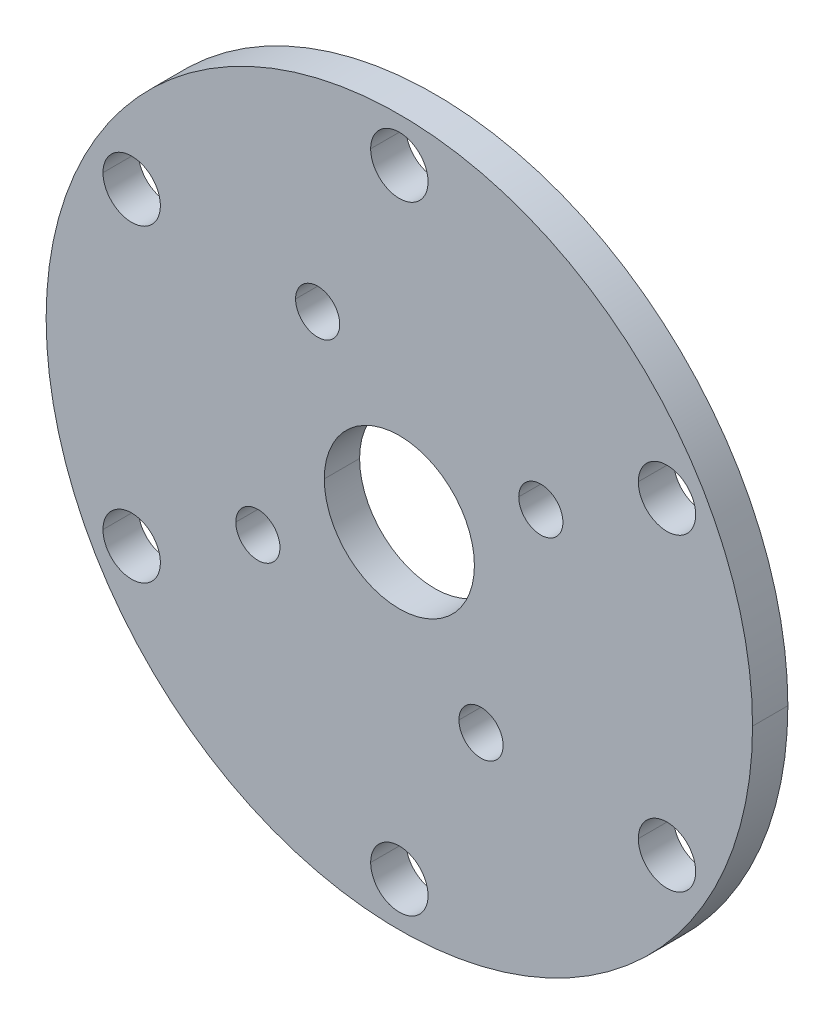
ISO-10303-21;
HEADER;
FILE_DESCRIPTION(('STEP AP214'),'2;1');
FILE_NAME('part.step','',(''),(''),'','','');
FILE_SCHEMA(('AUTOMOTIVE_DESIGN { 1 0 10303 214 1 1 1 1 }'));
ENDSEC;
DATA;
#1=APPLICATION_CONTEXT('core data for automotive mechanical design processes');
#2=APPLICATION_PROTOCOL_DEFINITION('international standard','automotive_design',2000,#1);
#3=PRODUCT_CONTEXT('',#1,'mechanical');
#4=PRODUCT('Part','Part','',(#3));
#5=PRODUCT_RELATED_PRODUCT_CATEGORY('part','',(#4));
#6=PRODUCT_DEFINITION_FORMATION('','',#4);
#7=PRODUCT_DEFINITION_CONTEXT('part definition',#1,'design');
#8=PRODUCT_DEFINITION('design','',#6,#7);
#9=PRODUCT_DEFINITION_SHAPE('','',#8);
#10=(LENGTH_UNIT() NAMED_UNIT(*) SI_UNIT(.MILLI.,.METRE.));
#11=(NAMED_UNIT(*) PLANE_ANGLE_UNIT() SI_UNIT($,.RADIAN.));
#12=(NAMED_UNIT(*) SI_UNIT($,.STERADIAN.) SOLID_ANGLE_UNIT());
#13=UNCERTAINTY_MEASURE_WITH_UNIT(LENGTH_MEASURE(1.E-05),#10,'distance_accuracy_value','');
#14=(GEOMETRIC_REPRESENTATION_CONTEXT(3) GLOBAL_UNCERTAINTY_ASSIGNED_CONTEXT((#13)) GLOBAL_UNIT_ASSIGNED_CONTEXT((#10,
#11,#12)) REPRESENTATION_CONTEXT('',''));
#15=CARTESIAN_POINT('',(0.,0.,0.));
#16=DIRECTION('',(0.,0.,1.));
#17=DIRECTION('',(1.,0.,0.));
#18=AXIS2_PLACEMENT_3D('',#15,#16,#17);
#19=CARTESIAN_POINT('',(0.,0.,4.));
#20=DIRECTION('',(0.,0.,-1.));
#21=DIRECTION('',(-1.,0.,0.));
#22=AXIS2_PLACEMENT_3D('',#19,#20,#21);
#23=CYLINDRICAL_SURFACE('',#22,40.);
#24=CARTESIAN_POINT('',(0.,0.,4.));
#25=DIRECTION('',(0.,0.,1.));
#26=DIRECTION('',(1.,0.,0.));
#27=AXIS2_PLACEMENT_3D('',#24,#25,#26);
#28=CIRCLE('',#27,40.);
#29=CARTESIAN_POINT('',(40.,0.,4.));
#30=VERTEX_POINT('',#29);
#31=CARTESIAN_POINT('',(-40.,0.,4.));
#32=VERTEX_POINT('',#31);
#33=EDGE_CURVE('E42',#30,#32,#28,.T.);
#34=ORIENTED_EDGE('',*,*,#33,.F.);
#35=DIRECTION('',(0.,0.,-1.));
#36=VECTOR('',#35,1.);
#37=CARTESIAN_POINT('',(40.,0.,4.));
#38=LINE('',#37,#36);
#39=CARTESIAN_POINT('',(40.,0.,0.));
#40=VERTEX_POINT('',#39);
#41=EDGE_CURVE('E11',#30,#40,#38,.T.);
#42=ORIENTED_EDGE('',*,*,#41,.T.);
#43=CARTESIAN_POINT('',(0.,0.,0.));
#44=DIRECTION('',(0.,0.,1.));
#45=DIRECTION('',(1.,0.,0.));
#46=AXIS2_PLACEMENT_3D('',#43,#44,#45);
#47=CIRCLE('',#46,40.);
#48=CARTESIAN_POINT('',(-40.,0.,0.));
#49=VERTEX_POINT('',#48);
#50=EDGE_CURVE('E28',#40,#49,#47,.T.);
#51=ORIENTED_EDGE('',*,*,#50,.T.);
#52=DIRECTION('',(0.,0.,-1.));
#53=VECTOR('',#52,1.);
#54=CARTESIAN_POINT('',(-40.,0.,4.));
#55=LINE('',#54,#53);
#56=EDGE_CURVE('E283',#32,#49,#55,.T.);
#57=ORIENTED_EDGE('',*,*,#56,.F.);
#58=EDGE_LOOP('',(#34,#42,#51,#57));
#59=FACE_BOUND('',#58,.T.);
#60=ADVANCED_FACE('F17',(#59),#23,.T.);
#61=CARTESIAN_POINT('',(-9.25,16.0214699700122,4.));
#62=DIRECTION('',(0.,0.,-1.));
#63=DIRECTION('',(-1.,0.,0.));
#64=AXIS2_PLACEMENT_3D('',#61,#62,#63);
#65=CYLINDRICAL_SURFACE('',#64,2.5);
#66=CARTESIAN_POINT('',(-9.25,16.0214699700122,4.));
#67=DIRECTION('',(0.,0.,1.));
#68=DIRECTION('',(1.,0.,0.));
#69=AXIS2_PLACEMENT_3D('',#66,#67,#68);
#70=CIRCLE('',#69,2.5);
#71=CARTESIAN_POINT('',(-11.75,16.0214699700122,4.));
#72=VERTEX_POINT('',#71);
#73=CARTESIAN_POINT('',(-6.74999999999991,16.0214699700122,4.));
#74=VERTEX_POINT('',#73);
#75=EDGE_CURVE('E330',#72,#74,#70,.T.);
#76=ORIENTED_EDGE('',*,*,#75,.T.);
#77=DIRECTION('',(0.,0.,-1.));
#78=VECTOR('',#77,1.);
#79=CARTESIAN_POINT('',(-6.74999999999991,16.0214699700122,4.));
#80=LINE('',#79,#78);
#81=CARTESIAN_POINT('',(-6.74999999999991,16.0214699700122,0.));
#82=VERTEX_POINT('',#81);
#83=EDGE_CURVE('E258',#74,#82,#80,.T.);
#84=ORIENTED_EDGE('',*,*,#83,.T.);
#85=CARTESIAN_POINT('',(-9.25,16.0214699700122,0.));
#86=DIRECTION('',(0.,0.,1.));
#87=DIRECTION('',(1.,0.,0.));
#88=AXIS2_PLACEMENT_3D('',#85,#86,#87);
#89=CIRCLE('',#88,2.5);
#90=CARTESIAN_POINT('',(-11.75,16.0214699700122,0.));
#91=VERTEX_POINT('',#90);
#92=EDGE_CURVE('E223',#91,#82,#89,.T.);
#93=ORIENTED_EDGE('',*,*,#92,.F.);
#94=DIRECTION('',(0.,0.,-1.));
#95=VECTOR('',#94,1.);
#96=CARTESIAN_POINT('',(-11.75,16.0214699700122,4.));
#97=LINE('',#96,#95);
#98=EDGE_CURVE('E331',#72,#91,#97,.T.);
#99=ORIENTED_EDGE('',*,*,#98,.F.);
#100=EDGE_LOOP('',(#76,#84,#93,#99));
#101=FACE_BOUND('',#100,.T.);
#102=ADVANCED_FACE('F574',(#101),#65,.F.);
#103=CARTESIAN_POINT('',(0.,0.,4.));
#104=DIRECTION('',(0.,0.,-1.));
#105=DIRECTION('',(-1.,0.,0.));
#106=AXIS2_PLACEMENT_3D('',#103,#104,#105);
#107=CYLINDRICAL_SURFACE('',#106,8.5);
#108=CARTESIAN_POINT('',(0.,0.,4.));
#109=DIRECTION('',(0.,0.,1.));
#110=DIRECTION('',(1.,0.,0.));
#111=AXIS2_PLACEMENT_3D('',#108,#109,#110);
#112=CIRCLE('',#111,8.5);
#113=CARTESIAN_POINT('',(-8.5,0.,4.));
#114=VERTEX_POINT('',#113);
#115=CARTESIAN_POINT('',(8.5,0.,4.));
#116=VERTEX_POINT('',#115);
#117=EDGE_CURVE('E250',#114,#116,#112,.T.);
#118=ORIENTED_EDGE('',*,*,#117,.T.);
#119=DIRECTION('',(0.,0.,-1.));
#120=VECTOR('',#119,1.);
#121=CARTESIAN_POINT('',(8.5,0.,4.));
#122=LINE('',#121,#120);
#123=CARTESIAN_POINT('',(8.5,0.,0.));
#124=VERTEX_POINT('',#123);
#125=EDGE_CURVE('E240',#116,#124,#122,.T.);
#126=ORIENTED_EDGE('',*,*,#125,.T.);
#127=CARTESIAN_POINT('',(0.,0.,0.));
#128=DIRECTION('',(0.,0.,1.));
#129=DIRECTION('',(1.,0.,0.));
#130=AXIS2_PLACEMENT_3D('',#127,#128,#129);
#131=CIRCLE('',#130,8.5);
#132=CARTESIAN_POINT('',(-8.5,0.,0.));
#133=VERTEX_POINT('',#132);
#134=EDGE_CURVE('E398',#133,#124,#131,.T.);
#135=ORIENTED_EDGE('',*,*,#134,.F.);
#136=DIRECTION('',(0.,0.,-1.));
#137=VECTOR('',#136,1.);
#138=CARTESIAN_POINT('',(-8.5,0.,4.));
#139=LINE('',#138,#137);
#140=EDGE_CURVE('E255',#114,#133,#139,.T.);
#141=ORIENTED_EDGE('',*,*,#140,.F.);
#142=EDGE_LOOP('',(#118,#126,#135,#141));
#143=FACE_BOUND('',#142,.T.);
#144=ADVANCED_FACE('F254',(#143),#107,.F.);
#145=CARTESIAN_POINT('',(-16.0214699700117,-9.25,4.));
#146=DIRECTION('',(0.,0.,-1.));
#147=DIRECTION('',(-1.,0.,0.));
#148=AXIS2_PLACEMENT_3D('',#145,#146,#147);
#149=CYLINDRICAL_SURFACE('',#148,2.5);
#150=CARTESIAN_POINT('',(-16.0214699700117,-9.25,4.));
#151=DIRECTION('',(0.,0.,1.));
#152=DIRECTION('',(1.,0.,0.));
#153=AXIS2_PLACEMENT_3D('',#150,#151,#152);
#154=CIRCLE('',#153,2.5);
#155=CARTESIAN_POINT('',(-18.5214699700117,-9.25,4.));
#156=VERTEX_POINT('',#155);
#157=CARTESIAN_POINT('',(-13.5214699700116,-9.25,4.));
#158=VERTEX_POINT('',#157);
#159=EDGE_CURVE('E251',#156,#158,#154,.T.);
#160=ORIENTED_EDGE('',*,*,#159,.T.);
#161=DIRECTION('',(0.,0.,-1.));
#162=VECTOR('',#161,1.);
#163=CARTESIAN_POINT('',(-13.5214699700116,-9.25,4.));
#164=LINE('',#163,#162);
#165=CARTESIAN_POINT('',(-13.5214699700116,-9.25,0.));
#166=VERTEX_POINT('',#165);
#167=EDGE_CURVE('E304',#158,#166,#164,.T.);
#168=ORIENTED_EDGE('',*,*,#167,.T.);
#169=CARTESIAN_POINT('',(-16.0214699700117,-9.25,0.));
#170=DIRECTION('',(0.,0.,1.));
#171=DIRECTION('',(1.,0.,0.));
#172=AXIS2_PLACEMENT_3D('',#169,#170,#171);
#173=CIRCLE('',#172,2.5);
#174=CARTESIAN_POINT('',(-18.5214699700117,-9.25,0.));
#175=VERTEX_POINT('',#174);
#176=EDGE_CURVE('E395',#175,#166,#173,.T.);
#177=ORIENTED_EDGE('',*,*,#176,.F.);
#178=DIRECTION('',(0.,0.,-1.));
#179=VECTOR('',#178,1.);
#180=CARTESIAN_POINT('',(-18.5214699700117,-9.25,4.));
#181=LINE('',#180,#179);
#182=EDGE_CURVE('E263',#156,#175,#181,.T.);
#183=ORIENTED_EDGE('',*,*,#182,.F.);
#184=EDGE_LOOP('',(#160,#168,#177,#183));
#185=FACE_BOUND('',#184,.T.);
#186=ADVANCED_FACE('F584',(#185),#149,.F.);
#187=CARTESIAN_POINT('',(16.0214699700123,9.25000000000043,4.));
#188=DIRECTION('',(0.,0.,-1.));
#189=DIRECTION('',(-1.,0.,0.));
#190=AXIS2_PLACEMENT_3D('',#187,#188,#189);
#191=CYLINDRICAL_SURFACE('',#190,2.5);
#192=CARTESIAN_POINT('',(16.0214699700123,9.25000000000043,4.));
#193=DIRECTION('',(0.,0.,1.));
#194=DIRECTION('',(1.,0.,0.));
#195=AXIS2_PLACEMENT_3D('',#192,#193,#194);
#196=CIRCLE('',#195,2.5);
#197=CARTESIAN_POINT('',(13.5214699700123,9.25000000000043,4.));
#198=VERTEX_POINT('',#197);
#199=CARTESIAN_POINT('',(18.5214699700123,9.25000000000043,4.));
#200=VERTEX_POINT('',#199);
#201=EDGE_CURVE('E308',#198,#200,#196,.T.);
#202=ORIENTED_EDGE('',*,*,#201,.T.);
#203=DIRECTION('',(0.,0.,-1.));
#204=VECTOR('',#203,1.);
#205=CARTESIAN_POINT('',(18.5214699700123,9.25000000000043,4.));
#206=LINE('',#205,#204);
#207=CARTESIAN_POINT('',(18.5214699700123,9.25000000000043,0.));
#208=VERTEX_POINT('',#207);
#209=EDGE_CURVE('E334',#200,#208,#206,.T.);
#210=ORIENTED_EDGE('',*,*,#209,.T.);
#211=CARTESIAN_POINT('',(16.0214699700123,9.25000000000043,0.));
#212=DIRECTION('',(0.,0.,1.));
#213=DIRECTION('',(1.,0.,0.));
#214=AXIS2_PLACEMENT_3D('',#211,#212,#213);
#215=CIRCLE('',#214,2.5);
#216=CARTESIAN_POINT('',(13.5214699700123,9.25000000000043,0.));
#217=VERTEX_POINT('',#216);
#218=EDGE_CURVE('E345',#217,#208,#215,.T.);
#219=ORIENTED_EDGE('',*,*,#218,.F.);
#220=DIRECTION('',(0.,0.,-1.));
#221=VECTOR('',#220,1.);
#222=CARTESIAN_POINT('',(13.5214699700123,9.25000000000043,4.));
#223=LINE('',#222,#221);
#224=EDGE_CURVE('E288',#198,#217,#223,.T.);
#225=ORIENTED_EDGE('',*,*,#224,.F.);
#226=EDGE_LOOP('',(#202,#210,#219,#225));
#227=FACE_BOUND('',#226,.T.);
#228=ADVANCED_FACE('F823',(#227),#191,.F.);
#229=CARTESIAN_POINT('',(-30.3108891324539,17.4999999999992,4.));
#230=DIRECTION('',(0.,0.,-1.));
#231=DIRECTION('',(-1.,0.,0.));
#232=AXIS2_PLACEMENT_3D('',#229,#230,#231);
#233=CYLINDRICAL_SURFACE('',#232,3.25000000000089);
#234=CARTESIAN_POINT('',(-30.3108891324539,17.4999999999992,4.));
#235=DIRECTION('',(0.,0.,1.));
#236=DIRECTION('',(1.,0.,0.));
#237=AXIS2_PLACEMENT_3D('',#234,#235,#236);
#238=CIRCLE('',#237,3.25000000000089);
#239=CARTESIAN_POINT('',(-33.5608891324547,17.4999999999992,4.));
#240=VERTEX_POINT('',#239);
#241=CARTESIAN_POINT('',(-27.060889132453,17.4999999999992,4.));
#242=VERTEX_POINT('',#241);
#243=EDGE_CURVE('E338',#240,#242,#238,.T.);
#244=ORIENTED_EDGE('',*,*,#243,.T.);
#245=DIRECTION('',(0.,0.,-1.));
#246=VECTOR('',#245,1.);
#247=CARTESIAN_POINT('',(-27.060889132453,17.4999999999992,4.));
#248=LINE('',#247,#246);
#249=CARTESIAN_POINT('',(-27.060889132453,17.4999999999992,0.));
#250=VERTEX_POINT('',#249);
#251=EDGE_CURVE('E462',#242,#250,#248,.T.);
#252=ORIENTED_EDGE('',*,*,#251,.T.);
#253=CARTESIAN_POINT('',(-30.3108891324539,17.4999999999992,0.));
#254=DIRECTION('',(0.,0.,1.));
#255=DIRECTION('',(1.,0.,0.));
#256=AXIS2_PLACEMENT_3D('',#253,#254,#255);
#257=CIRCLE('',#256,3.25000000000089);
#258=CARTESIAN_POINT('',(-33.5608891324547,17.4999999999992,0.));
#259=VERTEX_POINT('',#258);
#260=EDGE_CURVE('E357',#259,#250,#257,.T.);
#261=ORIENTED_EDGE('',*,*,#260,.F.);
#262=DIRECTION('',(0.,0.,-1.));
#263=VECTOR('',#262,1.);
#264=CARTESIAN_POINT('',(-33.5608891324547,17.4999999999992,4.));
#265=LINE('',#264,#263);
#266=EDGE_CURVE('E339',#240,#259,#265,.T.);
#267=ORIENTED_EDGE('',*,*,#266,.F.);
#268=EDGE_LOOP('',(#244,#252,#261,#267));
#269=FACE_BOUND('',#268,.T.);
#270=ADVANCED_FACE('F602',(#269),#233,.F.);
#271=CARTESIAN_POINT('',(9.25000000000057,-16.0214699700118,4.));
#272=DIRECTION('',(0.,0.,-1.));
#273=DIRECTION('',(-1.,0.,0.));
#274=AXIS2_PLACEMENT_3D('',#271,#272,#273);
#275=CYLINDRICAL_SURFACE('',#274,2.5);
#276=CARTESIAN_POINT('',(9.25000000000057,-16.0214699700118,4.));
#277=DIRECTION('',(0.,0.,1.));
#278=DIRECTION('',(1.,0.,0.));
#279=AXIS2_PLACEMENT_3D('',#276,#277,#278);
#280=CIRCLE('',#279,2.5);
#281=CARTESIAN_POINT('',(6.75000000000057,-16.0214699700118,4.));
#282=VERTEX_POINT('',#281);
#283=CARTESIAN_POINT('',(11.7500000000006,-16.0214699700118,4.));
#284=VERTEX_POINT('',#283);
#285=EDGE_CURVE('E466',#282,#284,#280,.T.);
#286=ORIENTED_EDGE('',*,*,#285,.T.);
#287=DIRECTION('',(0.,0.,-1.));
#288=VECTOR('',#287,1.);
#289=CARTESIAN_POINT('',(11.7500000000006,-16.0214699700118,4.));
#290=LINE('',#289,#288);
#291=CARTESIAN_POINT('',(11.7500000000006,-16.0214699700118,0.));
#292=VERTEX_POINT('',#291);
#293=EDGE_CURVE('E470',#284,#292,#290,.T.);
#294=ORIENTED_EDGE('',*,*,#293,.T.);
#295=CARTESIAN_POINT('',(9.25000000000057,-16.0214699700118,0.));
#296=DIRECTION('',(0.,0.,1.));
#297=DIRECTION('',(1.,0.,0.));
#298=AXIS2_PLACEMENT_3D('',#295,#296,#297);
#299=CIRCLE('',#298,2.5);
#300=CARTESIAN_POINT('',(6.75000000000057,-16.0214699700118,0.));
#301=VERTEX_POINT('',#300);
#302=EDGE_CURVE('E358',#301,#292,#299,.T.);
#303=ORIENTED_EDGE('',*,*,#302,.F.);
#304=DIRECTION('',(0.,0.,-1.));
#305=VECTOR('',#304,1.);
#306=CARTESIAN_POINT('',(6.75000000000057,-16.0214699700118,4.));
#307=LINE('',#306,#305);
#308=EDGE_CURVE('E454',#282,#301,#307,.T.);
#309=ORIENTED_EDGE('',*,*,#308,.F.);
#310=EDGE_LOOP('',(#286,#294,#303,#309));
#311=FACE_BOUND('',#310,.T.);
#312=ADVANCED_FACE('F519',(#311),#275,.F.);
#313=CARTESIAN_POINT('',(0.,35.,4.));
#314=DIRECTION('',(0.,0.,-1.));
#315=DIRECTION('',(-1.,0.,0.));
#316=AXIS2_PLACEMENT_3D('',#313,#314,#315);
#317=CYLINDRICAL_SURFACE('',#316,3.25);
#318=CARTESIAN_POINT('',(0.,35.,4.));
#319=DIRECTION('',(0.,0.,1.));
#320=DIRECTION('',(1.,0.,0.));
#321=AXIS2_PLACEMENT_3D('',#318,#319,#320);
#322=CIRCLE('',#321,3.25);
#323=CARTESIAN_POINT('',(-3.25,35.,4.));
#324=VERTEX_POINT('',#323);
#325=CARTESIAN_POINT('',(3.25,35.,4.));
#326=VERTEX_POINT('',#325);
#327=EDGE_CURVE('E474',#324,#326,#322,.T.);
#328=ORIENTED_EDGE('',*,*,#327,.T.);
#329=DIRECTION('',(0.,0.,-1.));
#330=VECTOR('',#329,1.);
#331=CARTESIAN_POINT('',(3.25,35.,4.));
#332=LINE('',#331,#330);
#333=CARTESIAN_POINT('',(3.25,35.,0.));
#334=VERTEX_POINT('',#333);
#335=EDGE_CURVE('E298',#326,#334,#332,.T.);
#336=ORIENTED_EDGE('',*,*,#335,.T.);
#337=CARTESIAN_POINT('',(0.,35.,0.));
#338=DIRECTION('',(0.,0.,1.));
#339=DIRECTION('',(1.,0.,0.));
#340=AXIS2_PLACEMENT_3D('',#337,#338,#339);
#341=CIRCLE('',#340,3.25);
#342=CARTESIAN_POINT('',(-3.25,35.,0.));
#343=VERTEX_POINT('',#342);
#344=EDGE_CURVE('E382',#343,#334,#341,.T.);
#345=ORIENTED_EDGE('',*,*,#344,.F.);
#346=DIRECTION('',(0.,0.,-1.));
#347=VECTOR('',#346,1.);
#348=CARTESIAN_POINT('',(-3.25,35.,4.));
#349=LINE('',#348,#347);
#350=EDGE_CURVE('E389',#324,#343,#349,.T.);
#351=ORIENTED_EDGE('',*,*,#350,.F.);
#352=EDGE_LOOP('',(#328,#336,#345,#351));
#353=FACE_BOUND('',#352,.T.);
#354=ADVANCED_FACE('F815',(#353),#317,.F.);
#355=CARTESIAN_POINT('',(-30.3108891324524,-17.5,4.));
#356=DIRECTION('',(0.,0.,-1.));
#357=DIRECTION('',(-1.,0.,0.));
#358=AXIS2_PLACEMENT_3D('',#355,#356,#357);
#359=CYLINDRICAL_SURFACE('',#358,3.25000000000247);
#360=CARTESIAN_POINT('',(-30.3108891324524,-17.5,4.));
#361=DIRECTION('',(0.,0.,1.));
#362=DIRECTION('',(1.,0.,0.));
#363=AXIS2_PLACEMENT_3D('',#360,#361,#362);
#364=CIRCLE('',#363,3.25000000000247);
#365=CARTESIAN_POINT('',(-33.5608891324548,-17.5,4.));
#366=VERTEX_POINT('',#365);
#367=CARTESIAN_POINT('',(-27.0608891324499,-17.5,4.));
#368=VERTEX_POINT('',#367);
#369=EDGE_CURVE('E294',#366,#368,#364,.T.);
#370=ORIENTED_EDGE('',*,*,#369,.T.);
#371=DIRECTION('',(0.,0.,-1.));
#372=VECTOR('',#371,1.);
#373=CARTESIAN_POINT('',(-27.0608891324499,-17.5,4.));
#374=LINE('',#373,#372);
#375=CARTESIAN_POINT('',(-27.0608891324499,-17.5,0.));
#376=VERTEX_POINT('',#375);
#377=EDGE_CURVE('E299',#368,#376,#374,.T.);
#378=ORIENTED_EDGE('',*,*,#377,.T.);
#379=CARTESIAN_POINT('',(-30.3108891324524,-17.5,0.));
#380=DIRECTION('',(0.,0.,1.));
#381=DIRECTION('',(1.,0.,0.));
#382=AXIS2_PLACEMENT_3D('',#379,#380,#381);
#383=CIRCLE('',#382,3.25000000000247);
#384=CARTESIAN_POINT('',(-33.5608891324548,-17.5,0.));
#385=VERTEX_POINT('',#384);
#386=EDGE_CURVE('E362',#385,#376,#383,.T.);
#387=ORIENTED_EDGE('',*,*,#386,.F.);
#388=DIRECTION('',(0.,0.,-1.));
#389=VECTOR('',#388,1.);
#390=CARTESIAN_POINT('',(-33.5608891324548,-17.5,4.));
#391=LINE('',#390,#389);
#392=EDGE_CURVE('E388',#366,#385,#391,.T.);
#393=ORIENTED_EDGE('',*,*,#392,.F.);
#394=EDGE_LOOP('',(#370,#378,#387,#393));
#395=FACE_BOUND('',#394,.T.);
#396=ADVANCED_FACE('F568',(#395),#359,.F.);
#397=CARTESIAN_POINT('',(2.95747950929986E-12,-34.9999999999983,4.));
#398=DIRECTION('',(0.,0.,-1.));
#399=DIRECTION('',(-1.,0.,0.));
#400=AXIS2_PLACEMENT_3D('',#397,#398,#399);
#401=CYLINDRICAL_SURFACE('',#400,3.25000000000357);
#402=CARTESIAN_POINT('',(2.95747950929986E-12,-34.9999999999983,4.));
#403=DIRECTION('',(0.,0.,1.));
#404=DIRECTION('',(1.,0.,0.));
#405=AXIS2_PLACEMENT_3D('',#402,#403,#404);
#406=CIRCLE('',#405,3.25000000000357);
#407=CARTESIAN_POINT('',(-3.25000000000061,-34.9999999999983,4.));
#408=VERTEX_POINT('',#407);
#409=CARTESIAN_POINT('',(3.25000000000653,-34.9999999999983,4.));
#410=VERTEX_POINT('',#409);
#411=EDGE_CURVE('E402',#408,#410,#406,.T.);
#412=ORIENTED_EDGE('',*,*,#411,.T.);
#413=DIRECTION('',(0.,0.,-1.));
#414=VECTOR('',#413,1.);
#415=CARTESIAN_POINT('',(3.25000000000653,-34.9999999999983,4.));
#416=LINE('',#415,#414);
#417=CARTESIAN_POINT('',(3.25000000000653,-34.9999999999983,0.));
#418=VERTEX_POINT('',#417);
#419=EDGE_CURVE('E436',#410,#418,#416,.T.);
#420=ORIENTED_EDGE('',*,*,#419,.T.);
#421=CARTESIAN_POINT('',(2.95747950929986E-12,-34.9999999999983,0.));
#422=DIRECTION('',(0.,0.,1.));
#423=DIRECTION('',(1.,0.,0.));
#424=AXIS2_PLACEMENT_3D('',#421,#422,#423);
#425=CIRCLE('',#424,3.25000000000357);
#426=CARTESIAN_POINT('',(-3.25000000000061,-34.9999999999983,0.));
#427=VERTEX_POINT('',#426);
#428=EDGE_CURVE('E371',#427,#418,#425,.T.);
#429=ORIENTED_EDGE('',*,*,#428,.F.);
#430=DIRECTION('',(0.,0.,-1.));
#431=VECTOR('',#430,1.);
#432=CARTESIAN_POINT('',(-3.25000000000061,-34.9999999999983,4.));
#433=LINE('',#432,#431);
#434=EDGE_CURVE('E309',#408,#427,#433,.T.);
#435=ORIENTED_EDGE('',*,*,#434,.F.);
#436=EDGE_LOOP('',(#412,#420,#429,#435));
#437=FACE_BOUND('',#436,.T.);
#438=ADVANCED_FACE('F560',(#437),#401,.F.);
#439=CARTESIAN_POINT('',(30.3108891324568,-17.4999999999974,4.));
#440=DIRECTION('',(0.,0.,-1.));
#441=DIRECTION('',(-1.,0.,0.));
#442=AXIS2_PLACEMENT_3D('',#439,#440,#441);
#443=CYLINDRICAL_SURFACE('',#442,3.25000000000301);
#444=CARTESIAN_POINT('',(30.3108891324568,-17.4999999999974,4.));
#445=DIRECTION('',(0.,0.,1.));
#446=DIRECTION('',(1.,0.,0.));
#447=AXIS2_PLACEMENT_3D('',#444,#445,#446);
#448=CIRCLE('',#447,3.25000000000301);
#449=CARTESIAN_POINT('',(27.0608891324538,-17.4999999999974,4.));
#450=VERTEX_POINT('',#449);
#451=CARTESIAN_POINT('',(33.5608891324598,-17.4999999999974,4.));
#452=VERTEX_POINT('',#451);
#453=EDGE_CURVE('E440',#450,#452,#448,.T.);
#454=ORIENTED_EDGE('',*,*,#453,.T.);
#455=DIRECTION('',(0.,0.,-1.));
#456=VECTOR('',#455,1.);
#457=CARTESIAN_POINT('',(33.5608891324598,-17.4999999999974,4.));
#458=LINE('',#457,#456);
#459=CARTESIAN_POINT('',(33.5608891324598,-17.4999999999974,0.));
#460=VERTEX_POINT('',#459);
#461=EDGE_CURVE('E434',#452,#460,#458,.T.);
#462=ORIENTED_EDGE('',*,*,#461,.T.);
#463=CARTESIAN_POINT('',(30.3108891324568,-17.4999999999974,0.));
#464=DIRECTION('',(0.,0.,1.));
#465=DIRECTION('',(1.,0.,0.));
#466=AXIS2_PLACEMENT_3D('',#463,#464,#465);
#467=CIRCLE('',#466,3.25000000000301);
#468=CARTESIAN_POINT('',(27.0608891324538,-17.4999999999974,0.));
#469=VERTEX_POINT('',#468);
#470=EDGE_CURVE('E372',#469,#460,#467,.T.);
#471=ORIENTED_EDGE('',*,*,#470,.F.);
#472=DIRECTION('',(0.,0.,-1.));
#473=VECTOR('',#472,1.);
#474=CARTESIAN_POINT('',(27.0608891324538,-17.4999999999974,4.));
#475=LINE('',#474,#473);
#476=EDGE_CURVE('E323',#450,#469,#475,.T.);
#477=ORIENTED_EDGE('',*,*,#476,.F.);
#478=EDGE_LOOP('',(#454,#462,#471,#477));
#479=FACE_BOUND('',#478,.T.);
#480=ADVANCED_FACE('F558',(#479),#443,.F.);
#481=CARTESIAN_POINT('',(30.3108891324554,17.5000000000017,4.));
#482=DIRECTION('',(0.,0.,-1.));
#483=DIRECTION('',(-1.,0.,0.));
#484=AXIS2_PLACEMENT_3D('',#481,#482,#483);
#485=CYLINDRICAL_SURFACE('',#484,3.25000000000125);
#486=CARTESIAN_POINT('',(30.3108891324554,17.5000000000017,4.));
#487=DIRECTION('',(0.,0.,1.));
#488=DIRECTION('',(1.,0.,0.));
#489=AXIS2_PLACEMENT_3D('',#486,#487,#488);
#490=CIRCLE('',#489,3.25000000000124);
#491=CARTESIAN_POINT('',(27.0608891324541,17.5000000000017,4.));
#492=VERTEX_POINT('',#491);
#493=CARTESIAN_POINT('',(33.5608891324566,17.5000000000017,4.));
#494=VERTEX_POINT('',#493);
#495=EDGE_CURVE('E303',#492,#494,#490,.T.);
#496=ORIENTED_EDGE('',*,*,#495,.T.);
#497=DIRECTION('',(0.,0.,-1.));
#498=VECTOR('',#497,1.);
#499=CARTESIAN_POINT('',(33.5608891324566,17.5000000000017,4.));
#500=LINE('',#499,#498);
#501=CARTESIAN_POINT('',(33.5608891324566,17.5000000000017,0.));
#502=VERTEX_POINT('',#501);
#503=EDGE_CURVE('E293',#494,#502,#500,.T.);
#504=ORIENTED_EDGE('',*,*,#503,.T.);
#505=CARTESIAN_POINT('',(30.3108891324554,17.5000000000017,0.));
#506=DIRECTION('',(0.,0.,1.));
#507=DIRECTION('',(1.,0.,0.));
#508=AXIS2_PLACEMENT_3D('',#505,#506,#507);
#509=CIRCLE('',#508,3.25000000000124);
#510=CARTESIAN_POINT('',(27.0608891324541,17.5000000000017,0.));
#511=VERTEX_POINT('',#510);
#512=EDGE_CURVE('E322',#511,#502,#509,.T.);
#513=ORIENTED_EDGE('',*,*,#512,.F.);
#514=DIRECTION('',(0.,0.,-1.));
#515=VECTOR('',#514,1.);
#516=CARTESIAN_POINT('',(27.0608891324541,17.5000000000017,4.));
#517=LINE('',#516,#515);
#518=EDGE_CURVE('E21',#492,#511,#517,.T.);
#519=ORIENTED_EDGE('',*,*,#518,.F.);
#520=EDGE_LOOP('',(#496,#504,#513,#519));
#521=FACE_BOUND('',#520,.T.);
#522=ADVANCED_FACE('F539',(#521),#485,.F.);
#523=CARTESIAN_POINT('',(30.3108891324554,17.5000000000017,4.));
#524=DIRECTION('',(0.,0.,-1.));
#525=DIRECTION('',(-1.,0.,0.));
#526=AXIS2_PLACEMENT_3D('',#523,#524,#525);
#527=CYLINDRICAL_SURFACE('',#526,3.25000000000125);
#528=ORIENTED_EDGE('',*,*,#503,.F.);
#529=CARTESIAN_POINT('',(30.3108891324554,17.5000000000017,4.));
#530=DIRECTION('',(0.,0.,1.));
#531=DIRECTION('',(1.,0.,0.));
#532=AXIS2_PLACEMENT_3D('',#529,#530,#531);
#533=CIRCLE('',#532,3.25000000000124);
#534=EDGE_CURVE('E289',#494,#492,#533,.T.);
#535=ORIENTED_EDGE('',*,*,#534,.T.);
#536=ORIENTED_EDGE('',*,*,#518,.T.);
#537=CARTESIAN_POINT('',(30.3108891324554,17.5000000000017,0.));
#538=DIRECTION('',(0.,0.,1.));
#539=DIRECTION('',(1.,0.,0.));
#540=AXIS2_PLACEMENT_3D('',#537,#538,#539);
#541=CIRCLE('',#540,3.25000000000124);
#542=EDGE_CURVE('E318',#502,#511,#541,.T.);
#543=ORIENTED_EDGE('',*,*,#542,.F.);
#544=EDGE_LOOP('',(#528,#535,#536,#543));
#545=FACE_BOUND('',#544,.T.);
#546=ADVANCED_FACE('F543',(#545),#527,.F.);
#547=CARTESIAN_POINT('',(30.3108891324568,-17.4999999999974,4.));
#548=DIRECTION('',(0.,0.,-1.));
#549=DIRECTION('',(-1.,0.,0.));
#550=AXIS2_PLACEMENT_3D('',#547,#548,#549);
#551=CYLINDRICAL_SURFACE('',#550,3.25000000000301);
#552=ORIENTED_EDGE('',*,*,#461,.F.);
#553=CARTESIAN_POINT('',(30.3108891324568,-17.4999999999974,4.));
#554=DIRECTION('',(0.,0.,1.));
#555=DIRECTION('',(1.,0.,0.));
#556=AXIS2_PLACEMENT_3D('',#553,#554,#555);
#557=CIRCLE('',#556,3.25000000000301);
#558=EDGE_CURVE('E278',#452,#450,#557,.T.);
#559=ORIENTED_EDGE('',*,*,#558,.T.);
#560=ORIENTED_EDGE('',*,*,#476,.T.);
#561=CARTESIAN_POINT('',(30.3108891324568,-17.4999999999974,0.));
#562=DIRECTION('',(0.,0.,1.));
#563=DIRECTION('',(1.,0.,0.));
#564=AXIS2_PLACEMENT_3D('',#561,#562,#563);
#565=CIRCLE('',#564,3.25000000000301);
#566=EDGE_CURVE('E375',#460,#469,#565,.T.);
#567=ORIENTED_EDGE('',*,*,#566,.F.);
#568=EDGE_LOOP('',(#552,#559,#560,#567));
#569=FACE_BOUND('',#568,.T.);
#570=ADVANCED_FACE('F552',(#569),#551,.F.);
#571=CARTESIAN_POINT('',(2.95747950929986E-12,-34.9999999999983,4.));
#572=DIRECTION('',(0.,0.,-1.));
#573=DIRECTION('',(-1.,0.,0.));
#574=AXIS2_PLACEMENT_3D('',#571,#572,#573);
#575=CYLINDRICAL_SURFACE('',#574,3.25000000000357);
#576=ORIENTED_EDGE('',*,*,#419,.F.);
#577=CARTESIAN_POINT('',(2.95747950929986E-12,-34.9999999999983,4.));
#578=DIRECTION('',(0.,0.,1.));
#579=DIRECTION('',(1.,0.,0.));
#580=AXIS2_PLACEMENT_3D('',#577,#578,#579);
#581=CIRCLE('',#580,3.25000000000357);
#582=EDGE_CURVE('E313',#410,#408,#581,.T.);
#583=ORIENTED_EDGE('',*,*,#582,.T.);
#584=ORIENTED_EDGE('',*,*,#434,.T.);
#585=CARTESIAN_POINT('',(2.95747950929986E-12,-34.9999999999983,0.));
#586=DIRECTION('',(0.,0.,1.));
#587=DIRECTION('',(1.,0.,0.));
#588=AXIS2_PLACEMENT_3D('',#585,#586,#587);
#589=CIRCLE('',#588,3.25000000000357);
#590=EDGE_CURVE('E367',#418,#427,#589,.T.);
#591=ORIENTED_EDGE('',*,*,#590,.F.);
#592=EDGE_LOOP('',(#576,#583,#584,#591));
#593=FACE_BOUND('',#592,.T.);
#594=ADVANCED_FACE('F895',(#593),#575,.F.);
#595=CARTESIAN_POINT('',(-30.3108891324524,-17.5,4.));
#596=DIRECTION('',(0.,0.,-1.));
#597=DIRECTION('',(-1.,0.,0.));
#598=AXIS2_PLACEMENT_3D('',#595,#596,#597);
#599=CYLINDRICAL_SURFACE('',#598,3.25000000000247);
#600=ORIENTED_EDGE('',*,*,#377,.F.);
#601=CARTESIAN_POINT('',(-30.3108891324524,-17.5,4.));
#602=DIRECTION('',(0.,0.,1.));
#603=DIRECTION('',(1.,0.,0.));
#604=AXIS2_PLACEMENT_3D('',#601,#602,#603);
#605=CIRCLE('',#604,3.25000000000247);
#606=EDGE_CURVE('E314',#368,#366,#605,.T.);
#607=ORIENTED_EDGE('',*,*,#606,.T.);
#608=ORIENTED_EDGE('',*,*,#392,.T.);
#609=CARTESIAN_POINT('',(-30.3108891324524,-17.5,0.));
#610=DIRECTION('',(0.,0.,1.));
#611=DIRECTION('',(1.,0.,0.));
#612=AXIS2_PLACEMENT_3D('',#609,#610,#611);
#613=CIRCLE('',#612,3.25000000000247);
#614=EDGE_CURVE('E365',#376,#385,#613,.T.);
#615=ORIENTED_EDGE('',*,*,#614,.F.);
#616=EDGE_LOOP('',(#600,#607,#608,#615));
#617=FACE_BOUND('',#616,.T.);
#618=ADVANCED_FACE('F903',(#617),#599,.F.);
#619=CARTESIAN_POINT('',(0.,35.,4.));
#620=DIRECTION('',(0.,0.,-1.));
#621=DIRECTION('',(-1.,0.,0.));
#622=AXIS2_PLACEMENT_3D('',#619,#620,#621);
#623=CYLINDRICAL_SURFACE('',#622,3.25);
#624=ORIENTED_EDGE('',*,*,#335,.F.);
#625=CARTESIAN_POINT('',(0.,35.,4.));
#626=DIRECTION('',(0.,0.,1.));
#627=DIRECTION('',(1.,0.,0.));
#628=AXIS2_PLACEMENT_3D('',#625,#626,#627);
#629=CIRCLE('',#628,3.25);
#630=EDGE_CURVE('E384',#326,#324,#629,.T.);
#631=ORIENTED_EDGE('',*,*,#630,.T.);
#632=ORIENTED_EDGE('',*,*,#350,.T.);
#633=CARTESIAN_POINT('',(0.,35.,0.));
#634=DIRECTION('',(0.,0.,1.));
#635=DIRECTION('',(1.,0.,0.));
#636=AXIS2_PLACEMENT_3D('',#633,#634,#635);
#637=CIRCLE('',#636,3.25);
#638=EDGE_CURVE('E364',#334,#343,#637,.T.);
#639=ORIENTED_EDGE('',*,*,#638,.F.);
#640=EDGE_LOOP('',(#624,#631,#632,#639));
#641=FACE_BOUND('',#640,.T.);
#642=ADVANCED_FACE('F830',(#641),#623,.F.);
#643=CARTESIAN_POINT('',(9.25000000000057,-16.0214699700118,4.));
#644=DIRECTION('',(0.,0.,-1.));
#645=DIRECTION('',(-1.,0.,0.));
#646=AXIS2_PLACEMENT_3D('',#643,#644,#645);
#647=CYLINDRICAL_SURFACE('',#646,2.5);
#648=ORIENTED_EDGE('',*,*,#293,.F.);
#649=CARTESIAN_POINT('',(9.25000000000057,-16.0214699700118,4.));
#650=DIRECTION('',(0.,0.,1.));
#651=DIRECTION('',(1.,0.,0.));
#652=AXIS2_PLACEMENT_3D('',#649,#650,#651);
#653=CIRCLE('',#652,2.5);
#654=EDGE_CURVE('E444',#284,#282,#653,.T.);
#655=ORIENTED_EDGE('',*,*,#654,.T.);
#656=ORIENTED_EDGE('',*,*,#308,.T.);
#657=CARTESIAN_POINT('',(9.25000000000057,-16.0214699700118,0.));
#658=DIRECTION('',(0.,0.,1.));
#659=DIRECTION('',(1.,0.,0.));
#660=AXIS2_PLACEMENT_3D('',#657,#658,#659);
#661=CIRCLE('',#660,2.5);
#662=EDGE_CURVE('E379',#292,#301,#661,.T.);
#663=ORIENTED_EDGE('',*,*,#662,.F.);
#664=EDGE_LOOP('',(#648,#655,#656,#663));
#665=FACE_BOUND('',#664,.T.);
#666=ADVANCED_FACE('F524',(#665),#647,.F.);
#667=CARTESIAN_POINT('',(-30.3108891324539,17.4999999999992,4.));
#668=DIRECTION('',(0.,0.,-1.));
#669=DIRECTION('',(-1.,0.,0.));
#670=AXIS2_PLACEMENT_3D('',#667,#668,#669);
#671=CYLINDRICAL_SURFACE('',#670,3.25000000000089);
#672=ORIENTED_EDGE('',*,*,#251,.F.);
#673=CARTESIAN_POINT('',(-30.3108891324539,17.4999999999992,4.));
#674=DIRECTION('',(0.,0.,1.));
#675=DIRECTION('',(1.,0.,0.));
#676=AXIS2_PLACEMENT_3D('',#673,#674,#675);
#677=CIRCLE('',#676,3.25000000000089);
#678=EDGE_CURVE('E343',#242,#240,#677,.T.);
#679=ORIENTED_EDGE('',*,*,#678,.T.);
#680=ORIENTED_EDGE('',*,*,#266,.T.);
#681=CARTESIAN_POINT('',(-30.3108891324539,17.4999999999992,0.));
#682=DIRECTION('',(0.,0.,1.));
#683=DIRECTION('',(1.,0.,0.));
#684=AXIS2_PLACEMENT_3D('',#681,#682,#683);
#685=CIRCLE('',#684,3.25000000000089);
#686=EDGE_CURVE('E353',#250,#259,#685,.T.);
#687=ORIENTED_EDGE('',*,*,#686,.F.);
#688=EDGE_LOOP('',(#672,#679,#680,#687));
#689=FACE_BOUND('',#688,.T.);
#690=ADVANCED_FACE('F606',(#689),#671,.F.);
#691=CARTESIAN_POINT('',(16.0214699700123,9.25000000000043,4.));
#692=DIRECTION('',(0.,0.,-1.));
#693=DIRECTION('',(-1.,0.,0.));
#694=AXIS2_PLACEMENT_3D('',#691,#692,#693);
#695=CYLINDRICAL_SURFACE('',#694,2.5);
#696=ORIENTED_EDGE('',*,*,#209,.F.);
#697=CARTESIAN_POINT('',(16.0214699700123,9.25000000000043,4.));
#698=DIRECTION('',(0.,0.,1.));
#699=DIRECTION('',(1.,0.,0.));
#700=AXIS2_PLACEMENT_3D('',#697,#698,#699);
#701=CIRCLE('',#700,2.5);
#702=EDGE_CURVE('E344',#200,#198,#701,.T.);
#703=ORIENTED_EDGE('',*,*,#702,.T.);
#704=ORIENTED_EDGE('',*,*,#224,.T.);
#705=CARTESIAN_POINT('',(16.0214699700123,9.25000000000043,0.));
#706=DIRECTION('',(0.,0.,1.));
#707=DIRECTION('',(1.,0.,0.));
#708=AXIS2_PLACEMENT_3D('',#705,#706,#707);
#709=CIRCLE('',#708,2.5);
#710=EDGE_CURVE('E349',#208,#217,#709,.T.);
#711=ORIENTED_EDGE('',*,*,#710,.F.);
#712=EDGE_LOOP('',(#696,#703,#704,#711));
#713=FACE_BOUND('',#712,.T.);
#714=ADVANCED_FACE('F19',(#713),#695,.F.);
#715=CARTESIAN_POINT('',(-16.0214699700117,-9.25,4.));
#716=DIRECTION('',(0.,0.,-1.));
#717=DIRECTION('',(-1.,0.,0.));
#718=AXIS2_PLACEMENT_3D('',#715,#716,#717);
#719=CYLINDRICAL_SURFACE('',#718,2.5);
#720=ORIENTED_EDGE('',*,*,#167,.F.);
#721=CARTESIAN_POINT('',(-16.0214699700117,-9.25,4.));
#722=DIRECTION('',(0.,0.,1.));
#723=DIRECTION('',(1.,0.,0.));
#724=AXIS2_PLACEMENT_3D('',#721,#722,#723);
#725=CIRCLE('',#724,2.5);
#726=EDGE_CURVE('E271',#158,#156,#725,.T.);
#727=ORIENTED_EDGE('',*,*,#726,.T.);
#728=ORIENTED_EDGE('',*,*,#182,.T.);
#729=CARTESIAN_POINT('',(-16.0214699700117,-9.25,0.));
#730=DIRECTION('',(0.,0.,1.));
#731=DIRECTION('',(1.,0.,0.));
#732=AXIS2_PLACEMENT_3D('',#729,#730,#731);
#733=CIRCLE('',#732,2.5);
#734=EDGE_CURVE('E348',#166,#175,#733,.T.);
#735=ORIENTED_EDGE('',*,*,#734,.F.);
#736=EDGE_LOOP('',(#720,#727,#728,#735));
#737=FACE_BOUND('',#736,.T.);
#738=ADVANCED_FACE('F787',(#737),#719,.F.);
#739=CARTESIAN_POINT('',(0.,0.,4.));
#740=DIRECTION('',(0.,0.,-1.));
#741=DIRECTION('',(-1.,0.,0.));
#742=AXIS2_PLACEMENT_3D('',#739,#740,#741);
#743=CYLINDRICAL_SURFACE('',#742,8.5);
#744=ORIENTED_EDGE('',*,*,#125,.F.);
#745=CARTESIAN_POINT('',(0.,0.,4.));
#746=DIRECTION('',(0.,0.,1.));
#747=DIRECTION('',(1.,0.,0.));
#748=AXIS2_PLACEMENT_3D('',#745,#746,#747);
#749=CIRCLE('',#748,8.5);
#750=EDGE_CURVE('E245',#116,#114,#749,.T.);
#751=ORIENTED_EDGE('',*,*,#750,.T.);
#752=ORIENTED_EDGE('',*,*,#140,.T.);
#753=CARTESIAN_POINT('',(0.,0.,0.));
#754=DIRECTION('',(0.,0.,1.));
#755=DIRECTION('',(1.,0.,0.));
#756=AXIS2_PLACEMENT_3D('',#753,#754,#755);
#757=CIRCLE('',#756,8.5);
#758=EDGE_CURVE('E247',#124,#133,#757,.T.);
#759=ORIENTED_EDGE('',*,*,#758,.F.);
#760=EDGE_LOOP('',(#744,#751,#752,#759));
#761=FACE_BOUND('',#760,.T.);
#762=ADVANCED_FACE('F242',(#761),#743,.F.);
#763=CARTESIAN_POINT('',(-9.25,16.0214699700122,4.));
#764=DIRECTION('',(0.,0.,-1.));
#765=DIRECTION('',(-1.,0.,0.));
#766=AXIS2_PLACEMENT_3D('',#763,#764,#765);
#767=CYLINDRICAL_SURFACE('',#766,2.5);
#768=ORIENTED_EDGE('',*,*,#83,.F.);
#769=CARTESIAN_POINT('',(-9.25,16.0214699700122,4.));
#770=DIRECTION('',(0.,0.,1.));
#771=DIRECTION('',(1.,0.,0.));
#772=AXIS2_PLACEMENT_3D('',#769,#770,#771);
#773=CIRCLE('',#772,2.5);
#774=EDGE_CURVE('E274',#74,#72,#773,.T.);
#775=ORIENTED_EDGE('',*,*,#774,.T.);
#776=ORIENTED_EDGE('',*,*,#98,.T.);
#777=CARTESIAN_POINT('',(-9.25,16.0214699700122,0.));
#778=DIRECTION('',(0.,0.,1.));
#779=DIRECTION('',(1.,0.,0.));
#780=AXIS2_PLACEMENT_3D('',#777,#778,#779);
#781=CIRCLE('',#780,2.5);
#782=EDGE_CURVE('E352',#82,#91,#781,.T.);
#783=ORIENTED_EDGE('',*,*,#782,.F.);
#784=EDGE_LOOP('',(#768,#775,#776,#783));
#785=FACE_BOUND('',#784,.T.);
#786=ADVANCED_FACE('F411',(#785),#767,.F.);
#787=CARTESIAN_POINT('',(0.,0.,4.));
#788=DIRECTION('',(0.,0.,-1.));
#789=DIRECTION('',(-1.,0.,0.));
#790=AXIS2_PLACEMENT_3D('',#787,#788,#789);
#791=CYLINDRICAL_SURFACE('',#790,40.);
#792=ORIENTED_EDGE('',*,*,#41,.F.);
#793=CARTESIAN_POINT('',(0.,0.,4.));
#794=DIRECTION('',(0.,0.,1.));
#795=DIRECTION('',(1.,0.,0.));
#796=AXIS2_PLACEMENT_3D('',#793,#794,#795);
#797=CIRCLE('',#796,40.);
#798=EDGE_CURVE('E284',#32,#30,#797,.T.);
#799=ORIENTED_EDGE('',*,*,#798,.F.);
#800=ORIENTED_EDGE('',*,*,#56,.T.);
#801=CARTESIAN_POINT('',(0.,0.,0.));
#802=DIRECTION('',(0.,0.,1.));
#803=DIRECTION('',(1.,0.,0.));
#804=AXIS2_PLACEMENT_3D('',#801,#802,#803);
#805=CIRCLE('',#804,40.);
#806=EDGE_CURVE('E280',#49,#40,#805,.T.);
#807=ORIENTED_EDGE('',*,*,#806,.T.);
#808=EDGE_LOOP('',(#792,#799,#800,#807));
#809=FACE_BOUND('',#808,.T.);
#810=ADVANCED_FACE('F586',(#809),#791,.T.);
#811=CARTESIAN_POINT('',(0.,0.,4.));
#812=DIRECTION('',(0.,0.,1.));
#813=DIRECTION('',(1.,0.,0.));
#814=AXIS2_PLACEMENT_3D('',#811,#812,#813);
#815=PLANE('',#814);
#816=ORIENTED_EDGE('',*,*,#798,.T.);
#817=ORIENTED_EDGE('',*,*,#33,.T.);
#818=EDGE_LOOP('',(#816,#817));
#819=FACE_BOUND('',#818,.T.);
#820=ORIENTED_EDGE('',*,*,#75,.F.);
#821=ORIENTED_EDGE('',*,*,#774,.F.);
#822=EDGE_LOOP('',(#820,#821));
#823=FACE_BOUND('',#822,.T.);
#824=ORIENTED_EDGE('',*,*,#117,.F.);
#825=ORIENTED_EDGE('',*,*,#750,.F.);
#826=EDGE_LOOP('',(#824,#825));
#827=FACE_BOUND('',#826,.T.);
#828=ORIENTED_EDGE('',*,*,#159,.F.);
#829=ORIENTED_EDGE('',*,*,#726,.F.);
#830=EDGE_LOOP('',(#828,#829));
#831=FACE_BOUND('',#830,.T.);
#832=ORIENTED_EDGE('',*,*,#201,.F.);
#833=ORIENTED_EDGE('',*,*,#702,.F.);
#834=EDGE_LOOP('',(#832,#833));
#835=FACE_BOUND('',#834,.T.);
#836=ORIENTED_EDGE('',*,*,#243,.F.);
#837=ORIENTED_EDGE('',*,*,#678,.F.);
#838=EDGE_LOOP('',(#836,#837));
#839=FACE_BOUND('',#838,.T.);
#840=ORIENTED_EDGE('',*,*,#285,.F.);
#841=ORIENTED_EDGE('',*,*,#654,.F.);
#842=EDGE_LOOP('',(#840,#841));
#843=FACE_BOUND('',#842,.T.);
#844=ORIENTED_EDGE('',*,*,#327,.F.);
#845=ORIENTED_EDGE('',*,*,#630,.F.);
#846=EDGE_LOOP('',(#844,#845));
#847=FACE_BOUND('',#846,.T.);
#848=ORIENTED_EDGE('',*,*,#369,.F.);
#849=ORIENTED_EDGE('',*,*,#606,.F.);
#850=EDGE_LOOP('',(#848,#849));
#851=FACE_BOUND('',#850,.T.);
#852=ORIENTED_EDGE('',*,*,#411,.F.);
#853=ORIENTED_EDGE('',*,*,#582,.F.);
#854=EDGE_LOOP('',(#852,#853));
#855=FACE_BOUND('',#854,.T.);
#856=ORIENTED_EDGE('',*,*,#453,.F.);
#857=ORIENTED_EDGE('',*,*,#558,.F.);
#858=EDGE_LOOP('',(#856,#857));
#859=FACE_BOUND('',#858,.T.);
#860=ORIENTED_EDGE('',*,*,#495,.F.);
#861=ORIENTED_EDGE('',*,*,#534,.F.);
#862=EDGE_LOOP('',(#860,#861));
#863=FACE_BOUND('',#862,.T.);
#864=ADVANCED_FACE('F260',(#819,#823,#827,#831,#835,#839,#843,#847,#851,#855,#859,#863),#815,.T.);
#865=CARTESIAN_POINT('',(0.,0.,0.));
#866=DIRECTION('',(0.,0.,1.));
#867=DIRECTION('',(1.,0.,0.));
#868=AXIS2_PLACEMENT_3D('',#865,#866,#867);
#869=PLANE('',#868);
#870=ORIENTED_EDGE('',*,*,#806,.F.);
#871=ORIENTED_EDGE('',*,*,#50,.F.);
#872=EDGE_LOOP('',(#870,#871));
#873=FACE_BOUND('',#872,.T.);
#874=ORIENTED_EDGE('',*,*,#92,.T.);
#875=ORIENTED_EDGE('',*,*,#782,.T.);
#876=EDGE_LOOP('',(#874,#875));
#877=FACE_BOUND('',#876,.T.);
#878=ORIENTED_EDGE('',*,*,#134,.T.);
#879=ORIENTED_EDGE('',*,*,#758,.T.);
#880=EDGE_LOOP('',(#878,#879));
#881=FACE_BOUND('',#880,.T.);
#882=ORIENTED_EDGE('',*,*,#176,.T.);
#883=ORIENTED_EDGE('',*,*,#734,.T.);
#884=EDGE_LOOP('',(#882,#883));
#885=FACE_BOUND('',#884,.T.);
#886=ORIENTED_EDGE('',*,*,#218,.T.);
#887=ORIENTED_EDGE('',*,*,#710,.T.);
#888=EDGE_LOOP('',(#886,#887));
#889=FACE_BOUND('',#888,.T.);
#890=ORIENTED_EDGE('',*,*,#260,.T.);
#891=ORIENTED_EDGE('',*,*,#686,.T.);
#892=EDGE_LOOP('',(#890,#891));
#893=FACE_BOUND('',#892,.T.);
#894=ORIENTED_EDGE('',*,*,#302,.T.);
#895=ORIENTED_EDGE('',*,*,#662,.T.);
#896=EDGE_LOOP('',(#894,#895));
#897=FACE_BOUND('',#896,.T.);
#898=ORIENTED_EDGE('',*,*,#344,.T.);
#899=ORIENTED_EDGE('',*,*,#638,.T.);
#900=EDGE_LOOP('',(#898,#899));
#901=FACE_BOUND('',#900,.T.);
#902=ORIENTED_EDGE('',*,*,#386,.T.);
#903=ORIENTED_EDGE('',*,*,#614,.T.);
#904=EDGE_LOOP('',(#902,#903));
#905=FACE_BOUND('',#904,.T.);
#906=ORIENTED_EDGE('',*,*,#428,.T.);
#907=ORIENTED_EDGE('',*,*,#590,.T.);
#908=EDGE_LOOP('',(#906,#907));
#909=FACE_BOUND('',#908,.T.);
#910=ORIENTED_EDGE('',*,*,#470,.T.);
#911=ORIENTED_EDGE('',*,*,#566,.T.);
#912=EDGE_LOOP('',(#910,#911));
#913=FACE_BOUND('',#912,.T.);
#914=ORIENTED_EDGE('',*,*,#512,.T.);
#915=ORIENTED_EDGE('',*,*,#542,.T.);
#916=EDGE_LOOP('',(#914,#915));
#917=FACE_BOUND('',#916,.T.);
#918=ADVANCED_FACE('F526',(#873,#877,#881,#885,#889,#893,#897,#901,#905,#909,#913,#917),#869,.F.);
#919=CLOSED_SHELL('',(#60,#102,#144,#186,#228,#270,#312,#354,#396,#438,#480,#522,#546,#570,#594,
#618,#642,#666,#690,#714,#738,#762,#786,#810,#864,#918));
#920=MANIFOLD_SOLID_BREP('B1',#919);
#921=ADVANCED_BREP_SHAPE_REPRESENTATION('',(#18,#920),#14);
#922=SHAPE_DEFINITION_REPRESENTATION(#9,#921);
ENDSEC;
END-ISO-10303-21;
